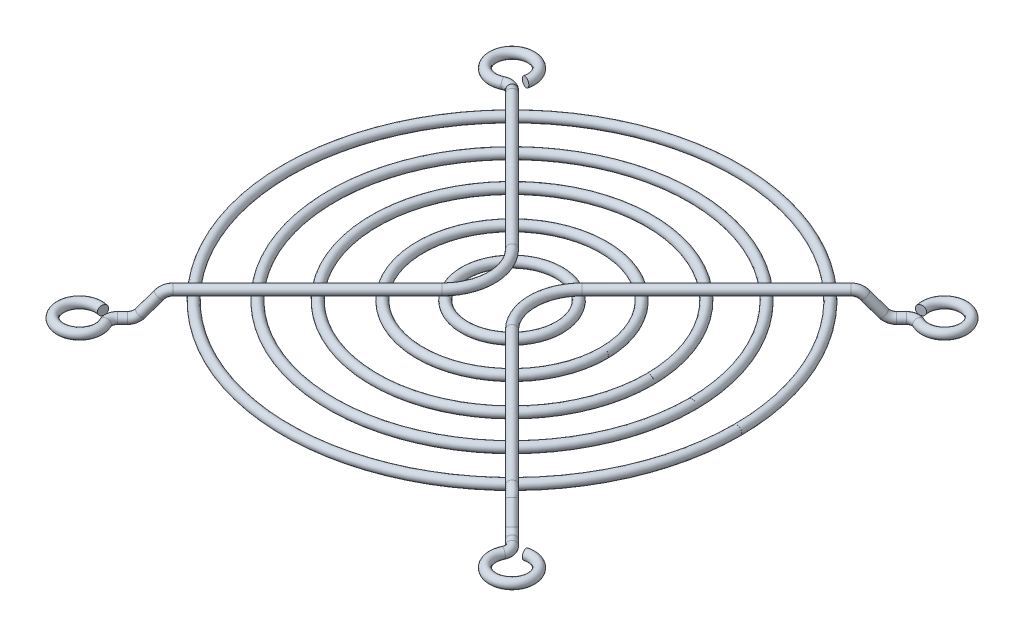
ISO-10303-21;
HEADER;
FILE_DESCRIPTION(('STEP AP214'),'2;1');
FILE_NAME('part.step','',(''),(''),'','','');
FILE_SCHEMA(('AUTOMOTIVE_DESIGN { 1 0 10303 214 1 1 1 1 }'));
ENDSEC;
DATA;
#1=APPLICATION_CONTEXT('core data for automotive mechanical design processes');
#2=APPLICATION_PROTOCOL_DEFINITION('international standard','automotive_design',2000,#1);
#3=PRODUCT_CONTEXT('',#1,'mechanical');
#4=PRODUCT('Part','Part','',(#3));
#5=PRODUCT_RELATED_PRODUCT_CATEGORY('part','',(#4));
#6=PRODUCT_DEFINITION_FORMATION('','',#4);
#7=PRODUCT_DEFINITION_CONTEXT('part definition',#1,'design');
#8=PRODUCT_DEFINITION('design','',#6,#7);
#9=PRODUCT_DEFINITION_SHAPE('','',#8);
#10=(LENGTH_UNIT() NAMED_UNIT(*) SI_UNIT(.MILLI.,.METRE.));
#11=(NAMED_UNIT(*) PLANE_ANGLE_UNIT() SI_UNIT($,.RADIAN.));
#12=(NAMED_UNIT(*) SI_UNIT($,.STERADIAN.) SOLID_ANGLE_UNIT());
#13=UNCERTAINTY_MEASURE_WITH_UNIT(LENGTH_MEASURE(1.E-05),#10,'distance_accuracy_value','');
#14=(GEOMETRIC_REPRESENTATION_CONTEXT(3) GLOBAL_UNCERTAINTY_ASSIGNED_CONTEXT((#13)) GLOBAL_UNIT_ASSIGNED_CONTEXT((#10,
#11,#12)) REPRESENTATION_CONTEXT('',''));
#15=CARTESIAN_POINT('',(0.,0.,0.));
#16=DIRECTION('',(0.,0.,1.));
#17=DIRECTION('',(1.,0.,0.));
#18=AXIS2_PLACEMENT_3D('',#15,#16,#17);
#19=CARTESIAN_POINT('',(0.,0.,0.));
#20=DIRECTION('',(0.,-1.,0.));
#21=DIRECTION('',(0.,0.,-1.));
#22=AXIS2_PLACEMENT_3D('',#19,#20,#21);
#23=TOROIDAL_SURFACE('',#22,72.9,1.5);
#24=CARTESIAN_POINT('',(72.8999972565157,0.,0.0199999999989709));
#25=DIRECTION('',(-0.000274348422482454,0.,0.999999962366471));
#26=DIRECTION('',(0.999999962366471,0.,0.000274348422482454));
#27=AXIS2_PLACEMENT_3D('',#24,#25,#26);
#28=CIRCLE('',#27,1.5);
#29=CARTESIAN_POINT('',(74.3999972000654,0.,0.0204115226326946));
#30=VERTEX_POINT('',#29);
#31=EDGE_CURVE('E11',#30,#30,#28,.T.);
#32=CARTESIAN_POINT('',(72.9,0.,0.));
#33=DIRECTION('',(0.,0.,1.));
#34=DIRECTION('',(1.,0.,0.));
#35=AXIS2_PLACEMENT_3D('',#32,#33,#34);
#36=CIRCLE('',#35,1.5);
#37=CARTESIAN_POINT('',(74.4,0.,0.));
#38=VERTEX_POINT('',#37);
#39=EDGE_CURVE('E48',#38,#38,#36,.T.);
#40=CARTESIAN_POINT('',(0.,0.,0.));
#41=DIRECTION('',(0.,-1.,0.));
#42=DIRECTION('',(0.,0.,-1.));
#43=AXIS2_PLACEMENT_3D('',#40,#41,#42);
#44=CIRCLE('',#43,74.4);
#45=EDGE_CURVE('',#30,#38,#44,.T.);
#46=ORIENTED_EDGE('',*,*,#31,.T.);
#47=ORIENTED_EDGE('',*,*,#39,.F.);
#48=ORIENTED_EDGE('',*,*,#45,.T.);
#49=ORIENTED_EDGE('',*,*,#45,.F.);
#50=EDGE_LOOP('',(#46,#48,#47,#49));
#51=FACE_BOUND('',#50,.T.);
#52=ADVANCED_FACE('F42',(#51),#23,.T.);
#53=CARTESIAN_POINT('',(72.8999972565157,0.,0.0199999999989709));
#54=DIRECTION('',(-0.000274348422482454,0.,0.999999962366471));
#55=DIRECTION('',(0.999999962366471,0.,0.000274348422482454));
#56=AXIS2_PLACEMENT_3D('',#53,#54,#55);
#57=PLANE('',#56);
#58=ORIENTED_EDGE('',*,*,#31,.F.);
#59=EDGE_LOOP('',(#58));
#60=FACE_BOUND('',#59,.T.);
#61=ADVANCED_FACE('F57',(#60),#57,.F.);
#62=CARTESIAN_POINT('',(72.9,0.,0.));
#63=DIRECTION('',(0.,0.,1.));
#64=DIRECTION('',(1.,0.,0.));
#65=AXIS2_PLACEMENT_3D('',#62,#63,#64);
#66=PLANE('',#65);
#67=ORIENTED_EDGE('',*,*,#39,.T.);
#68=EDGE_LOOP('',(#67));
#69=FACE_BOUND('',#68,.T.);
#70=ADVANCED_FACE('F54',(#69),#66,.T.);
#71=CLOSED_SHELL('',(#52,#61,#70));
#72=MANIFOLD_SOLID_BREP('B2',#71);
#73=CARTESIAN_POINT('',(0.,0.,0.));
#74=DIRECTION('',(0.,-1.,0.));
#75=DIRECTION('',(0.,0.,-1.));
#76=AXIS2_PLACEMENT_3D('',#73,#74,#75);
#77=TOROIDAL_SURFACE('',#76,58.3,1.5);
#78=CARTESIAN_POINT('',(58.2999978059652,0.,0.0159945130307271));
#79=DIRECTION('',(-0.000274348422482454,0.,0.999999962366471));
#80=DIRECTION('',(0.999999962366471,0.,0.000274348422482454));
#81=AXIS2_PLACEMENT_3D('',#78,#79,#80);
#82=CIRCLE('',#81,1.5);
#83=CARTESIAN_POINT('',(59.799997749515,0.,0.0164060356644508));
#84=VERTEX_POINT('',#83);
#85=EDGE_CURVE('E41',#84,#84,#82,.T.);
#86=CARTESIAN_POINT('',(58.3,0.,0.));
#87=DIRECTION('',(0.,0.,1.));
#88=DIRECTION('',(1.,0.,0.));
#89=AXIS2_PLACEMENT_3D('',#86,#87,#88);
#90=CIRCLE('',#89,1.5);
#91=CARTESIAN_POINT('',(59.8,0.,0.));
#92=VERTEX_POINT('',#91);
#93=EDGE_CURVE('E97',#92,#92,#90,.T.);
#94=CARTESIAN_POINT('',(0.,0.,0.));
#95=DIRECTION('',(0.,-1.,0.));
#96=DIRECTION('',(0.,0.,-1.));
#97=AXIS2_PLACEMENT_3D('',#94,#95,#96);
#98=CIRCLE('',#97,59.8);
#99=EDGE_CURVE('',#84,#92,#98,.T.);
#100=ORIENTED_EDGE('',*,*,#85,.T.);
#101=ORIENTED_EDGE('',*,*,#93,.F.);
#102=ORIENTED_EDGE('',*,*,#99,.T.);
#103=ORIENTED_EDGE('',*,*,#99,.F.);
#104=EDGE_LOOP('',(#100,#102,#101,#103));
#105=FACE_BOUND('',#104,.T.);
#106=ADVANCED_FACE('F91',(#105),#77,.T.);
#107=CARTESIAN_POINT('',(58.2999978059652,0.,0.0159945130307271));
#108=DIRECTION('',(-0.000274348422482454,0.,0.999999962366471));
#109=DIRECTION('',(0.999999962366471,0.,0.000274348422482454));
#110=AXIS2_PLACEMENT_3D('',#107,#108,#109);
#111=PLANE('',#110);
#112=ORIENTED_EDGE('',*,*,#85,.F.);
#113=EDGE_LOOP('',(#112));
#114=FACE_BOUND('',#113,.T.);
#115=ADVANCED_FACE('F106',(#114),#111,.F.);
#116=CARTESIAN_POINT('',(58.3,0.,0.));
#117=DIRECTION('',(0.,0.,1.));
#118=DIRECTION('',(1.,0.,0.));
#119=AXIS2_PLACEMENT_3D('',#116,#117,#118);
#120=PLANE('',#119);
#121=ORIENTED_EDGE('',*,*,#93,.T.);
#122=EDGE_LOOP('',(#121));
#123=FACE_BOUND('',#122,.T.);
#124=ADVANCED_FACE('F103',(#123),#120,.T.);
#125=CLOSED_SHELL('',(#106,#115,#124));
#126=MANIFOLD_SOLID_BREP('B6',#125);
#127=CARTESIAN_POINT('',(11.313708498985,3.,11.3137084989848));
#128=DIRECTION('',(0.707106781186546,0.,0.707106781186549));
#129=DIRECTION('',(0.707106781186549,0.,-0.707106781186546));
#130=AXIS2_PLACEMENT_3D('',#127,#128,#129);
#131=CYLINDRICAL_SURFACE('',#130,1.5);
#132=CARTESIAN_POINT('',(11.313708498985,3.,11.3137084989848));
#133=DIRECTION('',(-0.70710678118655,0.,-0.707106781186545));
#134=DIRECTION('',(-0.707106781186545,0.,0.70710678118655));
#135=AXIS2_PLACEMENT_3D('',#132,#133,#134);
#136=CIRCLE('',#135,1.5);
#137=CARTESIAN_POINT('',(10.2530483272052,3.,12.3743686707646));
#138=VERTEX_POINT('',#137);
#139=EDGE_CURVE('E90',#138,#138,#136,.T.);
#140=ORIENTED_EDGE('',*,*,#139,.F.);
#141=EDGE_LOOP('',(#140));
#142=FACE_BOUND('',#141,.T.);
#143=CARTESIAN_POINT('',(54.9039446917238,3.,54.9039446917236));
#144=DIRECTION('',(0.707106781186549,0.,0.707106781186546));
#145=DIRECTION('',(0.707106781186546,0.,-0.707106781186549));
#146=AXIS2_PLACEMENT_3D('',#143,#144,#145);
#147=CIRCLE('',#146,1.50000000000004);
#148=CARTESIAN_POINT('',(54.9039446917238,4.50000000000004,54.9039446917236));
#149=VERTEX_POINT('',#148);
#150=EDGE_CURVE('E174',#149,#149,#147,.T.);
#151=ORIENTED_EDGE('',*,*,#150,.F.);
#152=EDGE_LOOP('',(#151));
#153=FACE_BOUND('',#152,.T.);
#154=ADVANCED_FACE('F140',(#142,#153),#131,.T.);
#155=CARTESIAN_POINT('',(22.6274169979698,3.,0.));
#156=DIRECTION('',(0.,1.,0.));
#157=DIRECTION('',(0.,0.,1.));
#158=AXIS2_PLACEMENT_3D('',#155,#156,#157);
#159=TOROIDAL_SURFACE('',#158,16.,1.5);
#160=CARTESIAN_POINT('',(11.3137084989851,3.,-11.3137084989847));
#161=DIRECTION('',(0.707106781186546,0.,-0.707106781186549));
#162=DIRECTION('',(-0.707106781186549,0.,-0.707106781186546));
#163=AXIS2_PLACEMENT_3D('',#160,#161,#162);
#164=CIRCLE('',#163,1.5);
#165=CARTESIAN_POINT('',(10.2530483272052,3.,-12.3743686707646));
#166=VERTEX_POINT('',#165);
#167=EDGE_CURVE('E146',#166,#166,#164,.T.);
#168=CARTESIAN_POINT('',(22.6274169979698,3.,0.));
#169=DIRECTION('',(0.,1.,0.));
#170=DIRECTION('',(0.,0.,1.));
#171=AXIS2_PLACEMENT_3D('',#168,#169,#170);
#172=CIRCLE('',#171,17.5);
#173=EDGE_CURVE('',#166,#138,#172,.T.);
#174=ORIENTED_EDGE('',*,*,#167,.F.);
#175=ORIENTED_EDGE('',*,*,#139,.T.);
#176=ORIENTED_EDGE('',*,*,#173,.T.);
#177=ORIENTED_EDGE('',*,*,#173,.F.);
#178=EDGE_LOOP('',(#174,#176,#175,#177));
#179=FACE_BOUND('',#178,.T.);
#180=ADVANCED_FACE('F212',(#179),#159,.T.);
#181=CARTESIAN_POINT('',(11.3137084989851,3.,-11.3137084989847));
#182=DIRECTION('',(0.707106781186549,0.,-0.707106781186546));
#183=DIRECTION('',(-0.707106781186546,0.,-0.707106781186549));
#184=AXIS2_PLACEMENT_3D('',#181,#182,#183);
#185=CYLINDRICAL_SURFACE('',#184,1.5);
#186=ORIENTED_EDGE('',*,*,#167,.T.);
#187=EDGE_LOOP('',(#186));
#188=FACE_BOUND('',#187,.T.);
#189=CARTESIAN_POINT('',(54.9039446917237,3.,-54.9039446917233));
#190=DIRECTION('',(0.707106781186546,0.,-0.707106781186549));
#191=DIRECTION('',(-0.707106781186549,0.,-0.707106781186546));
#192=AXIS2_PLACEMENT_3D('',#189,#190,#191);
#193=CIRCLE('',#192,1.5);
#194=CARTESIAN_POINT('',(54.9039446917237,4.5,-54.9039446917233));
#195=VERTEX_POINT('',#194);
#196=EDGE_CURVE('E162',#195,#195,#193,.T.);
#197=ORIENTED_EDGE('',*,*,#196,.F.);
#198=EDGE_LOOP('',(#197));
#199=FACE_BOUND('',#198,.T.);
#200=ADVANCED_FACE('F202',(#188,#199),#185,.T.);
#201=CARTESIAN_POINT('',(62.2884434637014,-5.,-62.2884434637009));
#202=DIRECTION('',(0.707106781186553,0.,-0.707106781186542));
#203=DIRECTION('',(-0.707106781186542,0.,-0.707106781186553));
#204=AXIS2_PLACEMENT_3D('',#201,#202,#203);
#205=CYLINDRICAL_SURFACE('',#204,1.5);
#206=CARTESIAN_POINT('',(62.2884434637014,-5.,-62.2884434637009));
#207=DIRECTION('',(0.707106781186546,0.,-0.707106781186549));
#208=DIRECTION('',(-0.707106781186549,0.,-0.707106781186546));
#209=AXIS2_PLACEMENT_3D('',#206,#207,#208);
#210=CIRCLE('',#209,1.5);
#211=CARTESIAN_POINT('',(62.2884434637014,-6.5,-62.2884434637009));
#212=VERTEX_POINT('',#211);
#213=EDGE_CURVE('E150',#212,#212,#210,.T.);
#214=ORIENTED_EDGE('',*,*,#213,.T.);
#215=EDGE_LOOP('',(#214));
#216=FACE_BOUND('',#215,.T.);
#217=CARTESIAN_POINT('',(63.8502032553914,-5.00000000000001,-63.8502032553909));
#218=DIRECTION('',(0.707106781186546,0.,-0.707106781186549));
#219=DIRECTION('',(-0.707106781186549,0.,-0.707106781186546));
#220=AXIS2_PLACEMENT_3D('',#217,#218,#219);
#221=CIRCLE('',#220,1.49999999999999);
#222=CARTESIAN_POINT('',(62.7895430836116,-5.00000000000001,-64.9108634271708));
#223=VERTEX_POINT('',#222);
#224=EDGE_CURVE('E192',#223,#223,#221,.T.);
#225=ORIENTED_EDGE('',*,*,#224,.F.);
#226=EDGE_LOOP('',(#225));
#227=FACE_BOUND('',#226,.T.);
#228=ADVANCED_FACE('F199',(#216,#227),#205,.T.);
#229=CARTESIAN_POINT('',(62.2884434637014,-1.,-62.2884434637009));
#230=DIRECTION('',(0.707106781186546,0.,0.707106781186549));
#231=DIRECTION('',(0.707106781186549,0.,-0.707106781186546));
#232=AXIS2_PLACEMENT_3D('',#229,#230,#231);
#233=TOROIDAL_SURFACE('',#232,4.,1.5);
#234=CARTESIAN_POINT('',(60.1217425820226,-3.57115043874616,-60.1217425820221));
#235=DIRECTION('',(0.454519477672042,-0.766044443118977,-0.454519477672046));
#236=DIRECTION('',(-0.707106781186548,0.,-0.707106781186547));
#237=AXIS2_PLACEMENT_3D('',#234,#235,#236);
#238=CIRCLE('',#237,1.5);
#239=CARTESIAN_POINT('',(59.309229751393,-4.53533185327597,-59.3092297513925));
#240=VERTEX_POINT('',#239);
#241=EDGE_CURVE('E154',#240,#240,#238,.T.);
#242=CARTESIAN_POINT('',(62.2884434637014,-1.,-62.2884434637009));
#243=DIRECTION('',(0.707106781186546,0.,0.707106781186549));
#244=DIRECTION('',(0.707106781186549,0.,-0.707106781186546));
#245=AXIS2_PLACEMENT_3D('',#242,#243,#244);
#246=CIRCLE('',#245,5.5);
#247=EDGE_CURVE('',#240,#212,#246,.T.);
#248=ORIENTED_EDGE('',*,*,#241,.T.);
#249=ORIENTED_EDGE('',*,*,#213,.F.);
#250=ORIENTED_EDGE('',*,*,#247,.T.);
#251=ORIENTED_EDGE('',*,*,#247,.F.);
#252=EDGE_LOOP('',(#248,#250,#249,#251));
#253=FACE_BOUND('',#252,.T.);
#254=ADVANCED_FACE('F201',(#253),#233,.T.);
#255=CARTESIAN_POINT('',(57.0706455734025,1.57115043874616,-57.0706455734021));
#256=DIRECTION('',(0.454519477672046,-0.766044443118977,-0.454519477672043));
#257=DIRECTION('',(0.860012120645904,0.510273605374739,0.));
#258=AXIS2_PLACEMENT_3D('',#255,#256,#257);
#259=CYLINDRICAL_SURFACE('',#258,1.5);
#260=CARTESIAN_POINT('',(57.0706455734025,1.57115043874616,-57.0706455734021));
#261=DIRECTION('',(0.454519477672042,-0.766044443118977,-0.454519477672046));
#262=DIRECTION('',(-0.707106781186548,0.,-0.707106781186547));
#263=AXIS2_PLACEMENT_3D('',#260,#261,#262);
#264=CIRCLE('',#263,1.5);
#265=CARTESIAN_POINT('',(57.8831584040321,2.53533185327598,-57.8831584040316));
#266=VERTEX_POINT('',#265);
#267=EDGE_CURVE('E159',#266,#266,#264,.T.);
#268=ORIENTED_EDGE('',*,*,#267,.T.);
#269=EDGE_LOOP('',(#268));
#270=FACE_BOUND('',#269,.T.);
#271=ORIENTED_EDGE('',*,*,#241,.F.);
#272=EDGE_LOOP('',(#271));
#273=FACE_BOUND('',#272,.T.);
#274=ADVANCED_FACE('F209',(#270,#273),#259,.T.);
#275=CARTESIAN_POINT('',(54.9039446917237,-1.,-54.9039446917233));
#276=DIRECTION('',(-0.707106781186546,0.,-0.707106781186549));
#277=DIRECTION('',(-0.707106781186549,0.,0.707106781186546));
#278=AXIS2_PLACEMENT_3D('',#275,#276,#277);
#279=TOROIDAL_SURFACE('',#278,4.,1.5);
#280=CARTESIAN_POINT('',(54.9039446917237,-1.,-54.9039446917233));
#281=DIRECTION('',(-0.707106781186546,0.,-0.707106781186549));
#282=DIRECTION('',(-0.707106781186549,0.,0.707106781186546));
#283=AXIS2_PLACEMENT_3D('',#280,#281,#282);
#284=CIRCLE('',#283,5.5);
#285=EDGE_CURVE('',#195,#266,#284,.T.);
#286=ORIENTED_EDGE('',*,*,#196,.T.);
#287=ORIENTED_EDGE('',*,*,#267,.F.);
#288=ORIENTED_EDGE('',*,*,#285,.T.);
#289=ORIENTED_EDGE('',*,*,#285,.F.);
#290=EDGE_LOOP('',(#286,#288,#287,#289));
#291=FACE_BOUND('',#290,.T.);
#292=ADVANCED_FACE('F245',(#291),#279,.T.);
#293=CARTESIAN_POINT('',(62.2884434637014,-4.99999999999999,62.2884434637013));
#294=DIRECTION('',(0.707106781186553,0.,0.707106781186542));
#295=DIRECTION('',(0.707106781186542,0.,-0.707106781186553));
#296=AXIS2_PLACEMENT_3D('',#293,#294,#295);
#297=CYLINDRICAL_SURFACE('',#296,1.50000000000004);
#298=CARTESIAN_POINT('',(62.2884434637014,-4.99999999999999,62.2884434637013));
#299=DIRECTION('',(0.707106781186549,0.,0.707106781186546));
#300=DIRECTION('',(0.707106781186546,0.,-0.70710678118655));
#301=AXIS2_PLACEMENT_3D('',#298,#299,#300);
#302=CIRCLE('',#301,1.50000000000004);
#303=CARTESIAN_POINT('',(62.2884434637014,-6.50000000000004,62.2884434637013));
#304=VERTEX_POINT('',#303);
#305=EDGE_CURVE('E165',#304,#304,#302,.T.);
#306=ORIENTED_EDGE('',*,*,#305,.T.);
#307=EDGE_LOOP('',(#306));
#308=FACE_BOUND('',#307,.T.);
#309=CARTESIAN_POINT('',(63.8502032553914,-4.99999999999999,63.8502032553913));
#310=DIRECTION('',(0.707106781186549,0.,0.707106781186546));
#311=DIRECTION('',(0.707106781186546,0.,-0.707106781186549));
#312=AXIS2_PLACEMENT_3D('',#309,#310,#311);
#313=CIRCLE('',#312,1.50000000000001);
#314=CARTESIAN_POINT('',(64.9108634271712,-4.99999999999999,62.7895430836115));
#315=VERTEX_POINT('',#314);
#316=EDGE_CURVE('E183',#315,#315,#313,.T.);
#317=ORIENTED_EDGE('',*,*,#316,.F.);
#318=EDGE_LOOP('',(#317));
#319=FACE_BOUND('',#318,.T.);
#320=ADVANCED_FACE('F239',(#308,#319),#297,.T.);
#321=CARTESIAN_POINT('',(62.2884434637014,-1.,62.2884434637013));
#322=DIRECTION('',(-0.707106781186546,0.,0.707106781186549));
#323=DIRECTION('',(0.707106781186549,0.,0.707106781186546));
#324=AXIS2_PLACEMENT_3D('',#321,#322,#323);
#325=TOROIDAL_SURFACE('',#324,4.,1.50000000000004);
#326=CARTESIAN_POINT('',(60.1217425820226,-3.57115043874615,60.1217425820225));
#327=DIRECTION('',(0.454519477672045,-0.766044443118978,0.454519477672042));
#328=DIRECTION('',(0.707106781186546,0.,-0.707106781186549));
#329=AXIS2_PLACEMENT_3D('',#326,#327,#328);
#330=CIRCLE('',#329,1.50000000000004);
#331=CARTESIAN_POINT('',(59.309229751393,-4.53533185327598,59.3092297513929));
#332=VERTEX_POINT('',#331);
#333=EDGE_CURVE('E168',#332,#332,#330,.T.);
#334=CARTESIAN_POINT('',(62.2884434637014,-1.,62.2884434637013));
#335=DIRECTION('',(-0.707106781186546,0.,0.707106781186549));
#336=DIRECTION('',(0.707106781186549,0.,0.707106781186546));
#337=AXIS2_PLACEMENT_3D('',#334,#335,#336);
#338=CIRCLE('',#337,5.50000000000004);
#339=EDGE_CURVE('',#332,#304,#338,.T.);
#340=ORIENTED_EDGE('',*,*,#333,.T.);
#341=ORIENTED_EDGE('',*,*,#305,.F.);
#342=ORIENTED_EDGE('',*,*,#339,.T.);
#343=ORIENTED_EDGE('',*,*,#339,.F.);
#344=EDGE_LOOP('',(#340,#342,#341,#343));
#345=FACE_BOUND('',#344,.T.);
#346=ADVANCED_FACE('F233',(#345),#325,.T.);
#347=CARTESIAN_POINT('',(57.0706455734026,1.57115043874617,57.0706455734025));
#348=DIRECTION('',(0.454519477672043,-0.766044443118979,0.454519477672042));
#349=DIRECTION('',(0.860012120645906,0.510273605374736,0.));
#350=AXIS2_PLACEMENT_3D('',#347,#348,#349);
#351=CYLINDRICAL_SURFACE('',#350,1.50000000000004);
#352=CARTESIAN_POINT('',(57.0706455734026,1.57115043874617,57.0706455734025));
#353=DIRECTION('',(0.454519477672045,-0.766044443118978,0.454519477672042));
#354=DIRECTION('',(0.707106781186546,0.,-0.707106781186549));
#355=AXIS2_PLACEMENT_3D('',#352,#353,#354);
#356=CIRCLE('',#355,1.50000000000004);
#357=CARTESIAN_POINT('',(57.8831584040321,2.535331853276,57.883158404032));
#358=VERTEX_POINT('',#357);
#359=EDGE_CURVE('E171',#358,#358,#356,.T.);
#360=ORIENTED_EDGE('',*,*,#359,.T.);
#361=EDGE_LOOP('',(#360));
#362=FACE_BOUND('',#361,.T.);
#363=ORIENTED_EDGE('',*,*,#333,.F.);
#364=EDGE_LOOP('',(#363));
#365=FACE_BOUND('',#364,.T.);
#366=ADVANCED_FACE('F227',(#362,#365),#351,.T.);
#367=CARTESIAN_POINT('',(54.9039446917238,-1.,54.9039446917236));
#368=DIRECTION('',(0.707106781186546,0.,-0.707106781186549));
#369=DIRECTION('',(-0.707106781186549,0.,-0.707106781186546));
#370=AXIS2_PLACEMENT_3D('',#367,#368,#369);
#371=TOROIDAL_SURFACE('',#370,4.,1.50000000000004);
#372=CARTESIAN_POINT('',(54.9039446917238,-1.,54.9039446917236));
#373=DIRECTION('',(0.707106781186546,0.,-0.707106781186549));
#374=DIRECTION('',(-0.707106781186549,0.,-0.707106781186546));
#375=AXIS2_PLACEMENT_3D('',#372,#373,#374);
#376=CIRCLE('',#375,5.50000000000004);
#377=EDGE_CURVE('',#149,#358,#376,.T.);
#378=ORIENTED_EDGE('',*,*,#150,.T.);
#379=ORIENTED_EDGE('',*,*,#359,.F.);
#380=ORIENTED_EDGE('',*,*,#377,.T.);
#381=ORIENTED_EDGE('',*,*,#377,.F.);
#382=EDGE_LOOP('',(#378,#380,#379,#381));
#383=FACE_BOUND('',#382,.T.);
#384=ADVANCED_FACE('F223',(#383),#371,.T.);
#385=CARTESIAN_POINT('',(70.0000000000002,-4.99999999999999,70.));
#386=DIRECTION('',(0.,1.,0.));
#387=DIRECTION('',(0.,0.,1.));
#388=AXIS2_PLACEMENT_3D('',#385,#386,#387);
#389=TOROIDAL_SURFACE('',#388,6.2,1.50000000000001);
#390=CARTESIAN_POINT('',(64.4259863101476,-4.99999999999999,67.2851572079887));
#391=DIRECTION('',(-0.437877869679243,0.,0.899034466105259));
#392=DIRECTION('',(0.899034466105259,0.,0.437877869679243));
#393=AXIS2_PLACEMENT_3D('',#390,#391,#392);
#394=CIRCLE('',#393,1.50000000000001);
#395=CARTESIAN_POINT('',(63.0774346109897,-4.99999999999999,66.6283404034698));
#396=VERTEX_POINT('',#395);
#397=EDGE_CURVE('E180',#396,#396,#394,.T.);
#398=CARTESIAN_POINT('',(68.3953219203645,-4.99999999999999,64.0112598770078));
#399=DIRECTION('',(-0.965925826289065,0.,0.258819045102533));
#400=DIRECTION('',(0.258819045102533,0.,0.965925826289065));
#401=AXIS2_PLACEMENT_3D('',#398,#399,#400);
#402=CIRCLE('',#401,1.50000000000001);
#403=CARTESIAN_POINT('',(68.0070933527107,-4.99999999999999,62.5623711375742));
#404=VERTEX_POINT('',#403);
#405=EDGE_CURVE('E177',#404,#404,#402,.T.);
#406=CARTESIAN_POINT('',(70.0000000000002,-4.99999999999999,70.));
#407=DIRECTION('',(0.,1.,0.));
#408=DIRECTION('',(0.,0.,1.));
#409=AXIS2_PLACEMENT_3D('',#406,#407,#408);
#410=CIRCLE('',#409,7.70000000000001);
#411=EDGE_CURVE('',#396,#404,#410,.T.);
#412=ORIENTED_EDGE('',*,*,#397,.T.);
#413=ORIENTED_EDGE('',*,*,#405,.F.);
#414=ORIENTED_EDGE('',*,*,#411,.T.);
#415=ORIENTED_EDGE('',*,*,#411,.F.);
#416=EDGE_LOOP('',(#412,#414,#413,#415));
#417=FACE_BOUND('',#416,.T.);
#418=ADVANCED_FACE('F226',(#417),#389,.T.);
#419=CARTESIAN_POINT('',(61.7288829118318,-4.99999999999999,65.971523598951));
#420=DIRECTION('',(0.,-1.,0.));
#421=DIRECTION('',(0.,0.,-1.));
#422=AXIS2_PLACEMENT_3D('',#419,#420,#421);
#423=TOROIDAL_SURFACE('',#422,3.00000000000002,1.50000000000001);
#424=ORIENTED_EDGE('',*,*,#316,.T.);
#425=EDGE_LOOP('',(#424));
#426=FACE_BOUND('',#425,.T.);
#427=ORIENTED_EDGE('',*,*,#397,.F.);
#428=EDGE_LOOP('',(#427));
#429=FACE_BOUND('',#428,.T.);
#430=ADVANCED_FACE('F249',(#426,#429),#423,.T.);
#431=CARTESIAN_POINT('',(68.3953219203645,-4.99999999999999,64.0112598770078));
#432=DIRECTION('',(-0.965925826289065,0.,0.258819045102533));
#433=DIRECTION('',(0.258819045102533,0.,0.965925826289065));
#434=AXIS2_PLACEMENT_3D('',#431,#432,#433);
#435=PLANE('',#434);
#436=ORIENTED_EDGE('',*,*,#405,.T.);
#437=EDGE_LOOP('',(#436));
#438=FACE_BOUND('',#437,.T.);
#439=ADVANCED_FACE('F252',(#438),#435,.T.);
#440=CARTESIAN_POINT('',(70.0000000000002,-5.00000000000001,-69.9999999999997));
#441=DIRECTION('',(0.,1.,0.));
#442=DIRECTION('',(0.,0.,1.));
#443=AXIS2_PLACEMENT_3D('',#440,#441,#442);
#444=TOROIDAL_SURFACE('',#443,6.20000000000001,1.49999999999999);
#445=CARTESIAN_POINT('',(67.2851572079888,-5.00000000000001,-64.4259863101471));
#446=DIRECTION('',(0.899034466105257,0.,0.437877869679248));
#447=DIRECTION('',(0.437877869679248,0.,-0.899034466105257));
#448=AXIS2_PLACEMENT_3D('',#445,#446,#447);
#449=CIRCLE('',#448,1.49999999999999);
#450=CARTESIAN_POINT('',(66.62834040347,-5.00000000000001,-63.0774346109892));
#451=VERTEX_POINT('',#450);
#452=EDGE_CURVE('E189',#451,#451,#449,.T.);
#453=CARTESIAN_POINT('',(64.0112598770079,-5.00000000000001,-68.395321920364));
#454=DIRECTION('',(0.25881904510253,0.,0.965925826289066));
#455=DIRECTION('',(0.965925826289066,0.,-0.25881904510253));
#456=AXIS2_PLACEMENT_3D('',#453,#454,#455);
#457=CIRCLE('',#456,1.49999999999999);
#458=CARTESIAN_POINT('',(62.5623711375744,-5.00000000000001,-68.0070933527102));
#459=VERTEX_POINT('',#458);
#460=EDGE_CURVE('E186',#459,#459,#457,.T.);
#461=CARTESIAN_POINT('',(70.0000000000002,-5.00000000000001,-69.9999999999997));
#462=DIRECTION('',(0.,1.,0.));
#463=DIRECTION('',(0.,0.,1.));
#464=AXIS2_PLACEMENT_3D('',#461,#462,#463);
#465=CIRCLE('',#464,7.7);
#466=EDGE_CURVE('',#451,#459,#465,.T.);
#467=ORIENTED_EDGE('',*,*,#452,.T.);
#468=ORIENTED_EDGE('',*,*,#460,.F.);
#469=ORIENTED_EDGE('',*,*,#466,.T.);
#470=ORIENTED_EDGE('',*,*,#466,.F.);
#471=EDGE_LOOP('',(#467,#469,#468,#470));
#472=FACE_BOUND('',#471,.T.);
#473=ADVANCED_FACE('F262',(#472),#444,.T.);
#474=CARTESIAN_POINT('',(65.9715235989511,-5.00000000000001,-61.7288829118313));
#475=DIRECTION('',(0.,-1.,0.));
#476=DIRECTION('',(0.,0.,-1.));
#477=AXIS2_PLACEMENT_3D('',#474,#475,#476);
#478=TOROIDAL_SURFACE('',#477,3.00000000000003,1.49999999999999);
#479=ORIENTED_EDGE('',*,*,#224,.T.);
#480=EDGE_LOOP('',(#479));
#481=FACE_BOUND('',#480,.T.);
#482=ORIENTED_EDGE('',*,*,#452,.F.);
#483=EDGE_LOOP('',(#482));
#484=FACE_BOUND('',#483,.T.);
#485=ADVANCED_FACE('F196',(#481,#484),#478,.T.);
#486=CARTESIAN_POINT('',(64.0112598770079,-5.00000000000001,-68.395321920364));
#487=DIRECTION('',(0.25881904510253,0.,0.965925826289066));
#488=DIRECTION('',(0.965925826289066,0.,-0.25881904510253));
#489=AXIS2_PLACEMENT_3D('',#486,#487,#488);
#490=PLANE('',#489);
#491=ORIENTED_EDGE('',*,*,#460,.T.);
#492=EDGE_LOOP('',(#491));
#493=FACE_BOUND('',#492,.T.);
#494=ADVANCED_FACE('F333',(#493),#490,.T.);
#495=CLOSED_SHELL('',(#154,#180,#200,#228,#254,#274,#292,#320,#346,#366,#384,#418,#430,#439,
#473,#485,#494));
#496=MANIFOLD_SOLID_BREP('B36',#495);
#497=CARTESIAN_POINT('',(-11.313708498985,3.,11.3137084989848));
#498=DIRECTION('',(-0.707106781186546,0.,0.707106781186549));
#499=DIRECTION('',(0.707106781186549,0.,0.707106781186546));
#500=AXIS2_PLACEMENT_3D('',#497,#498,#499);
#501=CYLINDRICAL_SURFACE('',#500,1.5);
#502=CARTESIAN_POINT('',(-11.313708498985,3.,11.3137084989848));
#503=DIRECTION('',(-0.70710678118655,0.,0.707106781186545));
#504=DIRECTION('',(0.707106781186545,0.,0.70710678118655));
#505=AXIS2_PLACEMENT_3D('',#502,#503,#504);
#506=CIRCLE('',#505,1.5);
#507=CARTESIAN_POINT('',(-10.2530483272052,3.,12.3743686707646));
#508=VERTEX_POINT('',#507);
#509=EDGE_CURVE('E139',#508,#508,#506,.T.);
#510=ORIENTED_EDGE('',*,*,#509,.T.);
#511=EDGE_LOOP('',(#510));
#512=FACE_BOUND('',#511,.T.);
#513=CARTESIAN_POINT('',(-54.9039446917237,3.,54.9039446917237));
#514=DIRECTION('',(-0.70710678118655,0.,0.707106781186545));
#515=DIRECTION('',(0.707106781186545,0.,0.70710678118655));
#516=AXIS2_PLACEMENT_3D('',#513,#514,#515);
#517=CIRCLE('',#516,1.50000000000007);
#518=CARTESIAN_POINT('',(-54.9039446917237,4.50000000000007,54.9039446917237));
#519=VERTEX_POINT('',#518);
#520=EDGE_CURVE('E433',#519,#519,#517,.T.);
#521=ORIENTED_EDGE('',*,*,#520,.F.);
#522=EDGE_LOOP('',(#521));
#523=FACE_BOUND('',#522,.T.);
#524=ADVANCED_FACE('F411',(#512,#523),#501,.T.);
#525=CARTESIAN_POINT('',(-22.6274169979698,3.,0.));
#526=DIRECTION('',(0.,-1.,0.));
#527=DIRECTION('',(0.,0.,-1.));
#528=AXIS2_PLACEMENT_3D('',#525,#526,#527);
#529=TOROIDAL_SURFACE('',#528,16.,1.5);
#530=CARTESIAN_POINT('',(-11.3137084989851,3.,-11.3137084989847));
#531=DIRECTION('',(0.707106781186546,0.,0.707106781186549));
#532=DIRECTION('',(0.707106781186549,0.,-0.707106781186546));
#533=AXIS2_PLACEMENT_3D('',#530,#531,#532);
#534=CIRCLE('',#533,1.5);
#535=CARTESIAN_POINT('',(-10.2530483272053,3.,-12.3743686707646));
#536=VERTEX_POINT('',#535);
#537=EDGE_CURVE('E417',#536,#536,#534,.T.);
#538=CARTESIAN_POINT('',(-22.6274169979698,3.,0.));
#539=DIRECTION('',(0.,-1.,0.));
#540=DIRECTION('',(0.,0.,-1.));
#541=AXIS2_PLACEMENT_3D('',#538,#539,#540);
#542=CIRCLE('',#541,17.5);
#543=EDGE_CURVE('',#536,#508,#542,.T.);
#544=ORIENTED_EDGE('',*,*,#537,.T.);
#545=ORIENTED_EDGE('',*,*,#509,.F.);
#546=ORIENTED_EDGE('',*,*,#543,.T.);
#547=ORIENTED_EDGE('',*,*,#543,.F.);
#548=EDGE_LOOP('',(#544,#546,#545,#547));
#549=FACE_BOUND('',#548,.T.);
#550=ADVANCED_FACE('F487',(#549),#529,.T.);
#551=CARTESIAN_POINT('',(-11.3137084989851,3.,-11.3137084989847));
#552=DIRECTION('',(-0.707106781186549,0.,-0.707106781186546));
#553=DIRECTION('',(-0.707106781186546,0.,0.707106781186549));
#554=AXIS2_PLACEMENT_3D('',#551,#552,#553);
#555=CYLINDRICAL_SURFACE('',#554,1.5);
#556=ORIENTED_EDGE('',*,*,#537,.F.);
#557=EDGE_LOOP('',(#556));
#558=FACE_BOUND('',#557,.T.);
#559=CARTESIAN_POINT('',(-54.9039446917237,3.,-54.9039446917232));
#560=DIRECTION('',(-0.707106781186546,0.,-0.707106781186549));
#561=DIRECTION('',(-0.707106781186549,0.,0.707106781186546));
#562=AXIS2_PLACEMENT_3D('',#559,#560,#561);
#563=CIRCLE('',#562,1.5);
#564=CARTESIAN_POINT('',(-54.9039446917237,4.5,-54.9039446917232));
#565=VERTEX_POINT('',#564);
#566=EDGE_CURVE('E445',#565,#565,#563,.T.);
#567=ORIENTED_EDGE('',*,*,#566,.F.);
#568=EDGE_LOOP('',(#567));
#569=FACE_BOUND('',#568,.T.);
#570=ADVANCED_FACE('F491',(#558,#569),#555,.T.);
#571=CARTESIAN_POINT('',(-62.2884434637014,-5.,62.2884434637013));
#572=DIRECTION('',(-0.707106781186545,0.,0.70710678118655));
#573=DIRECTION('',(0.70710678118655,0.,0.707106781186545));
#574=AXIS2_PLACEMENT_3D('',#571,#572,#573);
#575=CYLINDRICAL_SURFACE('',#574,1.50000000000007);
#576=CARTESIAN_POINT('',(-62.2884434637014,-5.,62.2884434637013));
#577=DIRECTION('',(-0.70710678118655,0.,0.707106781186545));
#578=DIRECTION('',(0.707106781186545,0.,0.70710678118655));
#579=AXIS2_PLACEMENT_3D('',#576,#577,#578);
#580=CIRCLE('',#579,1.50000000000007);
#581=CARTESIAN_POINT('',(-62.2884434637014,-6.50000000000008,62.2884434637013));
#582=VERTEX_POINT('',#581);
#583=EDGE_CURVE('E421',#582,#582,#580,.T.);
#584=ORIENTED_EDGE('',*,*,#583,.T.);
#585=EDGE_LOOP('',(#584));
#586=FACE_BOUND('',#585,.T.);
#587=CARTESIAN_POINT('',(-63.8502032553913,-5.,63.8502032553912));
#588=DIRECTION('',(-0.70710678118655,0.,0.707106781186545));
#589=DIRECTION('',(0.707106781186545,0.,0.70710678118655));
#590=AXIS2_PLACEMENT_3D('',#587,#588,#589);
#591=CIRCLE('',#590,1.50000000000004);
#592=CARTESIAN_POINT('',(-62.7895430836115,-5.,64.9108634271711));
#593=VERTEX_POINT('',#592);
#594=EDGE_CURVE('E454',#593,#593,#591,.T.);
#595=ORIENTED_EDGE('',*,*,#594,.F.);
#596=EDGE_LOOP('',(#595));
#597=FACE_BOUND('',#596,.T.);
#598=ADVANCED_FACE('F505',(#586,#597),#575,.T.);
#599=CARTESIAN_POINT('',(-62.2884434637014,-1.,62.2884434637013));
#600=DIRECTION('',(-0.707106781186546,0.,-0.707106781186549));
#601=DIRECTION('',(-0.707106781186549,0.,0.707106781186546));
#602=AXIS2_PLACEMENT_3D('',#599,#600,#601);
#603=TOROIDAL_SURFACE('',#602,4.00000000000001,1.50000000000007);
#604=CARTESIAN_POINT('',(-60.1217425820226,-3.57115043874617,60.1217425820225));
#605=DIRECTION('',(-0.454519477672045,-0.766044443118979,0.454519477672041));
#606=DIRECTION('',(0.707106781186545,0.,0.70710678118655));
#607=AXIS2_PLACEMENT_3D('',#604,#605,#606);
#608=CIRCLE('',#607,1.50000000000007);
#609=CARTESIAN_POINT('',(-59.309229751393,-4.53533185327602,59.3092297513929));
#610=VERTEX_POINT('',#609);
#611=EDGE_CURVE('E425',#610,#610,#608,.T.);
#612=CARTESIAN_POINT('',(-62.2884434637014,-1.,62.2884434637013));
#613=DIRECTION('',(-0.707106781186546,0.,-0.707106781186549));
#614=DIRECTION('',(-0.707106781186549,0.,0.707106781186546));
#615=AXIS2_PLACEMENT_3D('',#612,#613,#614);
#616=CIRCLE('',#615,5.50000000000008);
#617=EDGE_CURVE('',#610,#582,#616,.T.);
#618=ORIENTED_EDGE('',*,*,#611,.T.);
#619=ORIENTED_EDGE('',*,*,#583,.F.);
#620=ORIENTED_EDGE('',*,*,#617,.T.);
#621=ORIENTED_EDGE('',*,*,#617,.F.);
#622=EDGE_LOOP('',(#618,#620,#619,#621));
#623=FACE_BOUND('',#622,.T.);
#624=ADVANCED_FACE('F499',(#623),#603,.T.);
#625=CARTESIAN_POINT('',(-57.0706455734026,1.57115043874614,57.0706455734025));
#626=DIRECTION('',(-0.454519477672044,-0.766044443118979,0.454519477672042));
#627=DIRECTION('',(0.860012120645905,-0.510273605374737,0.));
#628=AXIS2_PLACEMENT_3D('',#625,#626,#627);
#629=CYLINDRICAL_SURFACE('',#628,1.50000000000007);
#630=CARTESIAN_POINT('',(-57.0706455734026,1.57115043874614,57.0706455734025));
#631=DIRECTION('',(-0.454519477672045,-0.766044443118979,0.454519477672041));
#632=DIRECTION('',(0.707106781186545,0.,0.70710678118655));
#633=AXIS2_PLACEMENT_3D('',#630,#631,#632);
#634=CIRCLE('',#633,1.50000000000007);
#635=CARTESIAN_POINT('',(-57.8831584040321,2.53533185327599,57.8831584040321));
#636=VERTEX_POINT('',#635);
#637=EDGE_CURVE('E430',#636,#636,#634,.T.);
#638=ORIENTED_EDGE('',*,*,#637,.T.);
#639=EDGE_LOOP('',(#638));
#640=FACE_BOUND('',#639,.T.);
#641=ORIENTED_EDGE('',*,*,#611,.F.);
#642=EDGE_LOOP('',(#641));
#643=FACE_BOUND('',#642,.T.);
#644=ADVANCED_FACE('F483',(#640,#643),#629,.T.);
#645=CARTESIAN_POINT('',(-54.9039446917237,-1.,54.9039446917237));
#646=DIRECTION('',(0.707106781186546,0.,0.707106781186549));
#647=DIRECTION('',(0.707106781186549,0.,-0.707106781186546));
#648=AXIS2_PLACEMENT_3D('',#645,#646,#647);
#649=TOROIDAL_SURFACE('',#648,4.,1.50000000000007);
#650=CARTESIAN_POINT('',(-54.9039446917237,-1.,54.9039446917237));
#651=DIRECTION('',(0.707106781186546,0.,0.707106781186549));
#652=DIRECTION('',(0.707106781186549,0.,-0.707106781186546));
#653=AXIS2_PLACEMENT_3D('',#650,#651,#652);
#654=CIRCLE('',#653,5.50000000000007);
#655=EDGE_CURVE('',#519,#636,#654,.T.);
#656=ORIENTED_EDGE('',*,*,#520,.T.);
#657=ORIENTED_EDGE('',*,*,#637,.F.);
#658=ORIENTED_EDGE('',*,*,#655,.T.);
#659=ORIENTED_EDGE('',*,*,#655,.F.);
#660=EDGE_LOOP('',(#656,#658,#657,#659));
#661=FACE_BOUND('',#660,.T.);
#662=ADVANCED_FACE('F473',(#661),#649,.T.);
#663=CARTESIAN_POINT('',(-62.2884434637014,-5.,-62.2884434637009));
#664=DIRECTION('',(-0.707106781186553,0.,-0.707106781186542));
#665=DIRECTION('',(-0.707106781186542,0.,0.707106781186553));
#666=AXIS2_PLACEMENT_3D('',#663,#664,#665);
#667=CYLINDRICAL_SURFACE('',#666,1.5);
#668=CARTESIAN_POINT('',(-62.2884434637014,-5.,-62.2884434637009));
#669=DIRECTION('',(-0.707106781186546,0.,-0.707106781186549));
#670=DIRECTION('',(-0.707106781186549,0.,0.707106781186546));
#671=AXIS2_PLACEMENT_3D('',#668,#669,#670);
#672=CIRCLE('',#671,1.5);
#673=CARTESIAN_POINT('',(-62.2884434637014,-6.50000000000001,-62.2884434637008));
#674=VERTEX_POINT('',#673);
#675=EDGE_CURVE('E436',#674,#674,#672,.T.);
#676=ORIENTED_EDGE('',*,*,#675,.T.);
#677=EDGE_LOOP('',(#676));
#678=FACE_BOUND('',#677,.T.);
#679=CARTESIAN_POINT('',(-63.8502032553913,-5.00000000000001,-63.8502032553908));
#680=DIRECTION('',(-0.707106781186546,0.,-0.707106781186549));
#681=DIRECTION('',(-0.707106781186549,0.,0.707106781186546));
#682=AXIS2_PLACEMENT_3D('',#679,#680,#681);
#683=CIRCLE('',#682,1.49999999999999);
#684=CARTESIAN_POINT('',(-64.9108634271711,-5.00000000000001,-62.7895430836109));
#685=VERTEX_POINT('',#684);
#686=EDGE_CURVE('E463',#685,#685,#683,.T.);
#687=ORIENTED_EDGE('',*,*,#686,.F.);
#688=EDGE_LOOP('',(#687));
#689=FACE_BOUND('',#688,.T.);
#690=ADVANCED_FACE('F470',(#678,#689),#667,.T.);
#691=CARTESIAN_POINT('',(-62.2884434637014,-1.,-62.2884434637009));
#692=DIRECTION('',(0.707106781186546,0.,-0.707106781186549));
#693=DIRECTION('',(-0.707106781186549,0.,-0.707106781186546));
#694=AXIS2_PLACEMENT_3D('',#691,#692,#693);
#695=TOROIDAL_SURFACE('',#694,4.,1.5);
#696=CARTESIAN_POINT('',(-60.1217425820226,-3.57115043874616,-60.1217425820221));
#697=DIRECTION('',(-0.454519477672042,-0.766044443118977,-0.454519477672046));
#698=DIRECTION('',(-0.707106781186548,0.,0.707106781186547));
#699=AXIS2_PLACEMENT_3D('',#696,#697,#698);
#700=CIRCLE('',#699,1.5);
#701=CARTESIAN_POINT('',(-59.309229751393,-4.53533185327597,-59.3092297513925));
#702=VERTEX_POINT('',#701);
#703=EDGE_CURVE('E439',#702,#702,#700,.T.);
#704=CARTESIAN_POINT('',(-62.2884434637014,-1.,-62.2884434637009));
#705=DIRECTION('',(0.707106781186546,0.,-0.707106781186549));
#706=DIRECTION('',(-0.707106781186549,0.,-0.707106781186546));
#707=AXIS2_PLACEMENT_3D('',#704,#705,#706);
#708=CIRCLE('',#707,5.5);
#709=EDGE_CURVE('',#702,#674,#708,.T.);
#710=ORIENTED_EDGE('',*,*,#703,.T.);
#711=ORIENTED_EDGE('',*,*,#675,.F.);
#712=ORIENTED_EDGE('',*,*,#709,.T.);
#713=ORIENTED_EDGE('',*,*,#709,.F.);
#714=EDGE_LOOP('',(#710,#712,#711,#713));
#715=FACE_BOUND('',#714,.T.);
#716=ADVANCED_FACE('F472',(#715),#695,.T.);
#717=CARTESIAN_POINT('',(-57.0706455734025,1.57115043874616,-57.070645573402));
#718=DIRECTION('',(-0.454519477672046,-0.766044443118977,-0.454519477672043));
#719=DIRECTION('',(0.860012120645904,-0.510273605374739,0.));
#720=AXIS2_PLACEMENT_3D('',#717,#718,#719);
#721=CYLINDRICAL_SURFACE('',#720,1.5);
#722=CARTESIAN_POINT('',(-57.0706455734025,1.57115043874616,-57.070645573402));
#723=DIRECTION('',(-0.454519477672042,-0.766044443118977,-0.454519477672046));
#724=DIRECTION('',(-0.707106781186548,0.,0.707106781186547));
#725=AXIS2_PLACEMENT_3D('',#722,#723,#724);
#726=CIRCLE('',#725,1.5);
#727=CARTESIAN_POINT('',(-57.8831584040321,2.53533185327598,-57.8831584040316));
#728=VERTEX_POINT('',#727);
#729=EDGE_CURVE('E442',#728,#728,#726,.T.);
#730=ORIENTED_EDGE('',*,*,#729,.T.);
#731=EDGE_LOOP('',(#730));
#732=FACE_BOUND('',#731,.T.);
#733=ORIENTED_EDGE('',*,*,#703,.F.);
#734=EDGE_LOOP('',(#733));
#735=FACE_BOUND('',#734,.T.);
#736=ADVANCED_FACE('F480',(#732,#735),#721,.T.);
#737=CARTESIAN_POINT('',(-54.9039446917237,-1.,-54.9039446917232));
#738=DIRECTION('',(-0.707106781186546,0.,0.707106781186549));
#739=DIRECTION('',(0.707106781186549,0.,0.707106781186546));
#740=AXIS2_PLACEMENT_3D('',#737,#738,#739);
#741=TOROIDAL_SURFACE('',#740,4.,1.5);
#742=CARTESIAN_POINT('',(-54.9039446917237,-1.,-54.9039446917232));
#743=DIRECTION('',(-0.707106781186546,0.,0.707106781186549));
#744=DIRECTION('',(0.707106781186549,0.,0.707106781186546));
#745=AXIS2_PLACEMENT_3D('',#742,#743,#744);
#746=CIRCLE('',#745,5.5);
#747=EDGE_CURVE('',#565,#728,#746,.T.);
#748=ORIENTED_EDGE('',*,*,#566,.T.);
#749=ORIENTED_EDGE('',*,*,#729,.F.);
#750=ORIENTED_EDGE('',*,*,#747,.T.);
#751=ORIENTED_EDGE('',*,*,#747,.F.);
#752=EDGE_LOOP('',(#748,#750,#749,#751));
#753=FACE_BOUND('',#752,.T.);
#754=ADVANCED_FACE('F524',(#753),#741,.T.);
#755=CARTESIAN_POINT('',(-70.,-5.,70.));
#756=DIRECTION('',(0.,-1.,0.));
#757=DIRECTION('',(0.,0.,-1.));
#758=AXIS2_PLACEMENT_3D('',#755,#756,#757);
#759=TOROIDAL_SURFACE('',#758,6.19999999999994,1.50000000000004);
#760=CARTESIAN_POINT('',(-64.4259863101475,-5.,67.2851572079887));
#761=DIRECTION('',(0.437877869679252,0.,0.899034466105254));
#762=DIRECTION('',(0.899034466105254,0.,-0.437877869679252));
#763=AXIS2_PLACEMENT_3D('',#760,#761,#762);
#764=CIRCLE('',#763,1.50000000000004);
#765=CARTESIAN_POINT('',(-63.0774346109896,-5.,66.6283404034698));
#766=VERTEX_POINT('',#765);
#767=EDGE_CURVE('E451',#766,#766,#764,.T.);
#768=CARTESIAN_POINT('',(-68.3953219203644,-5.,64.0112598770079));
#769=DIRECTION('',(0.965925826289066,0.,0.258819045102529));
#770=DIRECTION('',(0.258819045102529,0.,-0.965925826289066));
#771=AXIS2_PLACEMENT_3D('',#768,#769,#770);
#772=CIRCLE('',#771,1.50000000000004);
#773=CARTESIAN_POINT('',(-68.0070933527105,-5.,62.5623711375742));
#774=VERTEX_POINT('',#773);
#775=EDGE_CURVE('E448',#774,#774,#772,.T.);
#776=CARTESIAN_POINT('',(-70.,-5.,70.));
#777=DIRECTION('',(0.,-1.,0.));
#778=DIRECTION('',(0.,0.,-1.));
#779=AXIS2_PLACEMENT_3D('',#776,#777,#778);
#780=CIRCLE('',#779,7.69999999999998);
#781=EDGE_CURVE('',#766,#774,#780,.T.);
#782=ORIENTED_EDGE('',*,*,#767,.T.);
#783=ORIENTED_EDGE('',*,*,#775,.F.);
#784=ORIENTED_EDGE('',*,*,#781,.T.);
#785=ORIENTED_EDGE('',*,*,#781,.F.);
#786=EDGE_LOOP('',(#782,#784,#783,#785));
#787=FACE_BOUND('',#786,.T.);
#788=ADVANCED_FACE('F518',(#787),#759,.T.);
#789=CARTESIAN_POINT('',(-61.7288829118317,-5.,65.9715235989509));
#790=DIRECTION('',(0.,1.,0.));
#791=DIRECTION('',(0.,0.,1.));
#792=AXIS2_PLACEMENT_3D('',#789,#790,#791);
#793=TOROIDAL_SURFACE('',#792,3.00000000000002,1.50000000000004);
#794=ORIENTED_EDGE('',*,*,#594,.T.);
#795=EDGE_LOOP('',(#794));
#796=FACE_BOUND('',#795,.T.);
#797=ORIENTED_EDGE('',*,*,#767,.F.);
#798=EDGE_LOOP('',(#797));
#799=FACE_BOUND('',#798,.T.);
#800=ADVANCED_FACE('F514',(#796,#799),#793,.T.);
#801=CARTESIAN_POINT('',(-68.3953219203644,-5.,64.0112598770079));
#802=DIRECTION('',(0.965925826289066,0.,0.258819045102529));
#803=DIRECTION('',(0.258819045102529,0.,-0.965925826289066));
#804=AXIS2_PLACEMENT_3D('',#801,#802,#803);
#805=PLANE('',#804);
#806=ORIENTED_EDGE('',*,*,#775,.T.);
#807=EDGE_LOOP('',(#806));
#808=FACE_BOUND('',#807,.T.);
#809=ADVANCED_FACE('F517',(#808),#805,.T.);
#810=CARTESIAN_POINT('',(-70.,-5.00000000000001,-69.9999999999995));
#811=DIRECTION('',(0.,-1.,0.));
#812=DIRECTION('',(0.,0.,-1.));
#813=AXIS2_PLACEMENT_3D('',#810,#811,#812);
#814=TOROIDAL_SURFACE('',#813,6.2,1.49999999999999);
#815=CARTESIAN_POINT('',(-67.2851572079887,-5.00000000000001,-64.4259863101469));
#816=DIRECTION('',(-0.899034466105257,0.,0.437877869679248));
#817=DIRECTION('',(0.437877869679248,0.,0.899034466105257));
#818=AXIS2_PLACEMENT_3D('',#815,#816,#817);
#819=CIRCLE('',#818,1.49999999999999);
#820=CARTESIAN_POINT('',(-66.6283404034698,-5.00000000000001,-63.077434610989));
#821=VERTEX_POINT('',#820);
#822=EDGE_CURVE('E460',#821,#821,#819,.T.);
#823=CARTESIAN_POINT('',(-64.0112598770078,-5.00000000000001,-68.3953219203638));
#824=DIRECTION('',(-0.258819045102533,0.,0.965925826289065));
#825=DIRECTION('',(0.965925826289065,0.,0.258819045102533));
#826=AXIS2_PLACEMENT_3D('',#823,#824,#825);
#827=CIRCLE('',#826,1.49999999999999);
#828=CARTESIAN_POINT('',(-62.5623711375742,-5.00000000000001,-68.00709335271));
#829=VERTEX_POINT('',#828);
#830=EDGE_CURVE('E457',#829,#829,#827,.T.);
#831=CARTESIAN_POINT('',(-70.,-5.00000000000001,-69.9999999999995));
#832=DIRECTION('',(0.,-1.,0.));
#833=DIRECTION('',(0.,0.,-1.));
#834=AXIS2_PLACEMENT_3D('',#831,#832,#833);
#835=CIRCLE('',#834,7.7);
#836=EDGE_CURVE('',#821,#829,#835,.T.);
#837=ORIENTED_EDGE('',*,*,#822,.T.);
#838=ORIENTED_EDGE('',*,*,#830,.F.);
#839=ORIENTED_EDGE('',*,*,#836,.T.);
#840=ORIENTED_EDGE('',*,*,#836,.F.);
#841=EDGE_LOOP('',(#837,#839,#838,#840));
#842=FACE_BOUND('',#841,.T.);
#843=ADVANCED_FACE('F529',(#842),#814,.T.);
#844=CARTESIAN_POINT('',(-65.9715235989509,-5.00000000000001,-61.7288829118311));
#845=DIRECTION('',(0.,1.,0.));
#846=DIRECTION('',(0.,0.,1.));
#847=AXIS2_PLACEMENT_3D('',#844,#845,#846);
#848=TOROIDAL_SURFACE('',#847,3.00000000000001,1.49999999999999);
#849=ORIENTED_EDGE('',*,*,#686,.T.);
#850=EDGE_LOOP('',(#849));
#851=FACE_BOUND('',#850,.T.);
#852=ORIENTED_EDGE('',*,*,#822,.F.);
#853=EDGE_LOOP('',(#852));
#854=FACE_BOUND('',#853,.T.);
#855=ADVANCED_FACE('F467',(#851,#854),#848,.T.);
#856=CARTESIAN_POINT('',(-64.0112598770078,-5.00000000000001,-68.3953219203638));
#857=DIRECTION('',(-0.258819045102533,0.,0.965925826289065));
#858=DIRECTION('',(0.965925826289065,0.,0.258819045102533));
#859=AXIS2_PLACEMENT_3D('',#856,#857,#858);
#860=PLANE('',#859);
#861=ORIENTED_EDGE('',*,*,#830,.T.);
#862=EDGE_LOOP('',(#861));
#863=FACE_BOUND('',#862,.T.);
#864=ADVANCED_FACE('F585',(#863),#860,.T.);
#865=CLOSED_SHELL('',(#524,#550,#570,#598,#624,#644,#662,#690,#716,#736,#754,#788,#800,#809,
#843,#855,#864));
#866=MANIFOLD_SOLID_BREP('B85',#865);
#867=CARTESIAN_POINT('',(0.,0.,0.));
#868=DIRECTION('',(0.,-1.,0.));
#869=DIRECTION('',(0.,0.,-1.));
#870=AXIS2_PLACEMENT_3D('',#867,#868,#869);
#871=TOROIDAL_SURFACE('',#870,44.5,1.5);
#872=CARTESIAN_POINT('',(44.499998325308,0.,0.0122085048004692));
#873=DIRECTION('',(-0.000274348422482454,0.,0.999999962366471));
#874=DIRECTION('',(0.999999962366471,0.,0.000274348422482454));
#875=AXIS2_PLACEMENT_3D('',#872,#873,#874);
#876=CIRCLE('',#875,1.5);
#877=CARTESIAN_POINT('',(45.9999982688577,0.,0.0126200274341929));
#878=VERTEX_POINT('',#877);
#879=EDGE_CURVE('E410',#878,#878,#876,.T.);
#880=CARTESIAN_POINT('',(44.5,0.,0.));
#881=DIRECTION('',(0.,0.,1.));
#882=DIRECTION('',(1.,0.,0.));
#883=AXIS2_PLACEMENT_3D('',#880,#881,#882);
#884=CIRCLE('',#883,1.5);
#885=CARTESIAN_POINT('',(46.,0.,0.));
#886=VERTEX_POINT('',#885);
#887=EDGE_CURVE('E688',#886,#886,#884,.T.);
#888=CARTESIAN_POINT('',(0.,0.,0.));
#889=DIRECTION('',(0.,-1.,0.));
#890=DIRECTION('',(0.,0.,-1.));
#891=AXIS2_PLACEMENT_3D('',#888,#889,#890);
#892=CIRCLE('',#891,46.);
#893=EDGE_CURVE('',#878,#886,#892,.T.);
#894=ORIENTED_EDGE('',*,*,#879,.T.);
#895=ORIENTED_EDGE('',*,*,#887,.F.);
#896=ORIENTED_EDGE('',*,*,#893,.T.);
#897=ORIENTED_EDGE('',*,*,#893,.F.);
#898=EDGE_LOOP('',(#894,#896,#895,#897));
#899=FACE_BOUND('',#898,.T.);
#900=ADVANCED_FACE('F682',(#899),#871,.T.);
#901=CARTESIAN_POINT('',(44.499998325308,0.,0.0122085048004692));
#902=DIRECTION('',(-0.000274348422482454,0.,0.999999962366471));
#903=DIRECTION('',(0.999999962366471,0.,0.000274348422482454));
#904=AXIS2_PLACEMENT_3D('',#901,#902,#903);
#905=PLANE('',#904);
#906=ORIENTED_EDGE('',*,*,#879,.F.);
#907=EDGE_LOOP('',(#906));
#908=FACE_BOUND('',#907,.T.);
#909=ADVANCED_FACE('F697',(#908),#905,.F.);
#910=CARTESIAN_POINT('',(44.5,0.,0.));
#911=DIRECTION('',(0.,0.,1.));
#912=DIRECTION('',(1.,0.,0.));
#913=AXIS2_PLACEMENT_3D('',#910,#911,#912);
#914=PLANE('',#913);
#915=ORIENTED_EDGE('',*,*,#887,.T.);
#916=EDGE_LOOP('',(#915));
#917=FACE_BOUND('',#916,.T.);
#918=ADVANCED_FACE('F694',(#917),#914,.T.);
#919=CLOSED_SHELL('',(#900,#909,#918));
#920=MANIFOLD_SOLID_BREP('B134',#919);
#921=CARTESIAN_POINT('',(0.,0.,0.));
#922=DIRECTION('',(0.,-1.,0.));
#923=DIRECTION('',(0.,0.,-1.));
#924=AXIS2_PLACEMENT_3D('',#921,#922,#923);
#925=TOROIDAL_SURFACE('',#924,29.7,1.5);
#926=CARTESIAN_POINT('',(29.6999988822842,0.,0.0081481481477289));
#927=DIRECTION('',(-0.000274348422482454,0.,0.999999962366471));
#928=DIRECTION('',(0.999999962366471,0.,0.000274348422482454));
#929=AXIS2_PLACEMENT_3D('',#926,#927,#928);
#930=CIRCLE('',#929,1.5);
#931=CARTESIAN_POINT('',(31.1999988258339,0.,0.00855967078145258));
#932=VERTEX_POINT('',#931);
#933=EDGE_CURVE('E681',#932,#932,#930,.T.);
#934=CARTESIAN_POINT('',(29.7,0.,0.));
#935=DIRECTION('',(0.,0.,1.));
#936=DIRECTION('',(1.,0.,0.));
#937=AXIS2_PLACEMENT_3D('',#934,#935,#936);
#938=CIRCLE('',#937,1.5);
#939=CARTESIAN_POINT('',(31.2,0.,0.));
#940=VERTEX_POINT('',#939);
#941=EDGE_CURVE('E736',#940,#940,#938,.T.);
#942=CARTESIAN_POINT('',(0.,0.,0.));
#943=DIRECTION('',(0.,-1.,0.));
#944=DIRECTION('',(0.,0.,-1.));
#945=AXIS2_PLACEMENT_3D('',#942,#943,#944);
#946=CIRCLE('',#945,31.2);
#947=EDGE_CURVE('',#932,#940,#946,.T.);
#948=ORIENTED_EDGE('',*,*,#933,.T.);
#949=ORIENTED_EDGE('',*,*,#941,.F.);
#950=ORIENTED_EDGE('',*,*,#947,.T.);
#951=ORIENTED_EDGE('',*,*,#947,.F.);
#952=EDGE_LOOP('',(#948,#950,#949,#951));
#953=FACE_BOUND('',#952,.T.);
#954=ADVANCED_FACE('F730',(#953),#925,.T.);
#955=CARTESIAN_POINT('',(29.6999988822842,0.,0.0081481481477289));
#956=DIRECTION('',(-0.000274348422482454,0.,0.999999962366471));
#957=DIRECTION('',(0.999999962366471,0.,0.000274348422482454));
#958=AXIS2_PLACEMENT_3D('',#955,#956,#957);
#959=PLANE('',#958);
#960=ORIENTED_EDGE('',*,*,#933,.F.);
#961=EDGE_LOOP('',(#960));
#962=FACE_BOUND('',#961,.T.);
#963=ADVANCED_FACE('F745',(#962),#959,.F.);
#964=CARTESIAN_POINT('',(29.7,0.,0.));
#965=DIRECTION('',(0.,0.,1.));
#966=DIRECTION('',(1.,0.,0.));
#967=AXIS2_PLACEMENT_3D('',#964,#965,#966);
#968=PLANE('',#967);
#969=ORIENTED_EDGE('',*,*,#941,.T.);
#970=EDGE_LOOP('',(#969));
#971=FACE_BOUND('',#970,.T.);
#972=ADVANCED_FACE('F742',(#971),#968,.T.);
#973=CLOSED_SHELL('',(#954,#963,#972));
#974=MANIFOLD_SOLID_BREP('B405',#973);
#975=CARTESIAN_POINT('',(0.,0.,0.));
#976=DIRECTION('',(0.,-1.,0.));
#977=DIRECTION('',(0.,0.,-1.));
#978=AXIS2_PLACEMENT_3D('',#975,#976,#977);
#979=TOROIDAL_SURFACE('',#978,15.3,1.5);
#980=CARTESIAN_POINT('',(15.299999424207,0.,0.00419753086398155));
#981=DIRECTION('',(-0.000274348422482454,0.,0.999999962366471));
#982=DIRECTION('',(0.999999962366471,0.,0.000274348422482454));
#983=AXIS2_PLACEMENT_3D('',#980,#981,#982);
#984=CIRCLE('',#983,1.5);
#985=CARTESIAN_POINT('',(16.7999993677567,0.,0.00460905349770524));
#986=VERTEX_POINT('',#985);
#987=EDGE_CURVE('E729',#986,#986,#984,.T.);
#988=CARTESIAN_POINT('',(15.3,0.,0.));
#989=DIRECTION('',(0.,0.,1.));
#990=DIRECTION('',(1.,0.,0.));
#991=AXIS2_PLACEMENT_3D('',#988,#989,#990);
#992=CIRCLE('',#991,1.5);
#993=CARTESIAN_POINT('',(16.8,0.,0.));
#994=VERTEX_POINT('',#993);
#995=EDGE_CURVE('E777',#994,#994,#992,.T.);
#996=CARTESIAN_POINT('',(0.,0.,0.));
#997=DIRECTION('',(0.,-1.,0.));
#998=DIRECTION('',(0.,0.,-1.));
#999=AXIS2_PLACEMENT_3D('',#996,#997,#998);
#1000=CIRCLE('',#999,16.8);
#1001=EDGE_CURVE('',#986,#994,#1000,.T.);
#1002=ORIENTED_EDGE('',*,*,#987,.T.);
#1003=ORIENTED_EDGE('',*,*,#995,.F.);
#1004=ORIENTED_EDGE('',*,*,#1001,.T.);
#1005=ORIENTED_EDGE('',*,*,#1001,.F.);
#1006=EDGE_LOOP('',(#1002,#1004,#1003,#1005));
#1007=FACE_BOUND('',#1006,.T.);
#1008=ADVANCED_FACE('F771',(#1007),#979,.T.);
#1009=CARTESIAN_POINT('',(15.299999424207,0.,0.00419753086398155));
#1010=DIRECTION('',(-0.000274348422482454,0.,0.999999962366471));
#1011=DIRECTION('',(0.999999962366471,0.,0.000274348422482454));
#1012=AXIS2_PLACEMENT_3D('',#1009,#1010,#1011);
#1013=PLANE('',#1012);
#1014=ORIENTED_EDGE('',*,*,#987,.F.);
#1015=EDGE_LOOP('',(#1014));
#1016=FACE_BOUND('',#1015,.T.);
#1017=ADVANCED_FACE('F786',(#1016),#1013,.F.);
#1018=CARTESIAN_POINT('',(15.3,0.,0.));
#1019=DIRECTION('',(0.,0.,1.));
#1020=DIRECTION('',(1.,0.,0.));
#1021=AXIS2_PLACEMENT_3D('',#1018,#1019,#1020);
#1022=PLANE('',#1021);
#1023=ORIENTED_EDGE('',*,*,#995,.T.);
#1024=EDGE_LOOP('',(#1023));
#1025=FACE_BOUND('',#1024,.T.);
#1026=ADVANCED_FACE('F783',(#1025),#1022,.T.);
#1027=CLOSED_SHELL('',(#1008,#1017,#1026));
#1028=MANIFOLD_SOLID_BREP('B676',#1027);
#1029=ADVANCED_BREP_SHAPE_REPRESENTATION('',(#18,#72,#126,#496,#866,#920,#974,#1028),#14);
#1030=SHAPE_DEFINITION_REPRESENTATION(#9,#1029);
ENDSEC;
END-ISO-10303-21;
